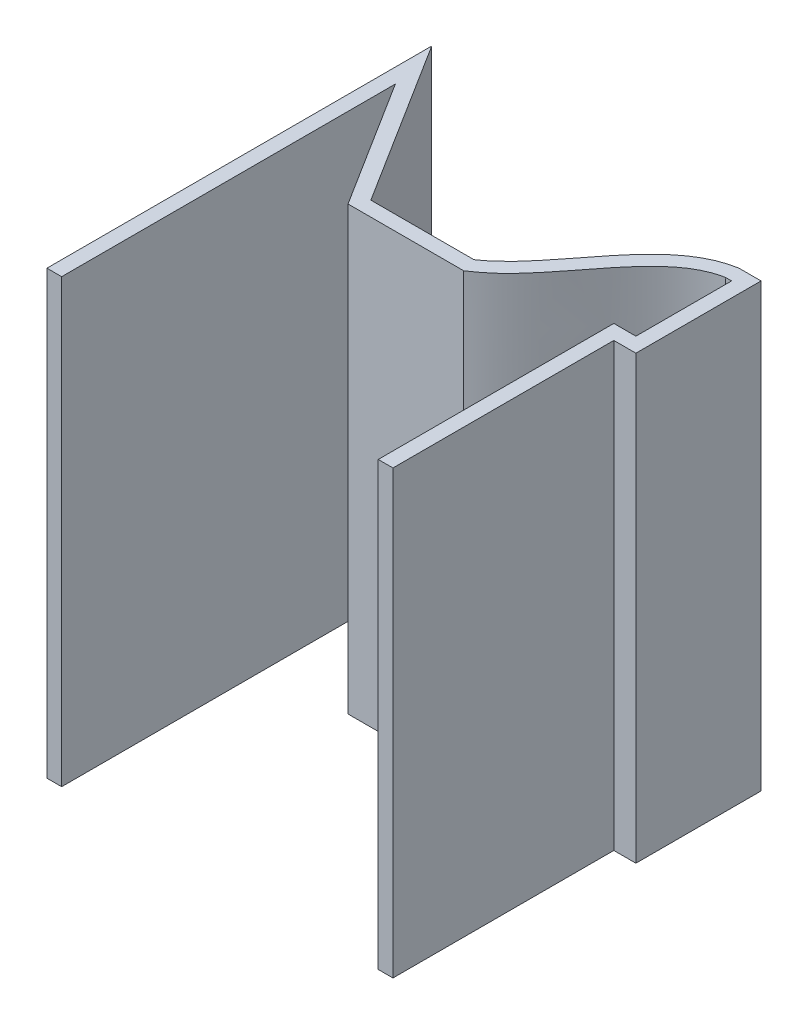
ISO-10303-21;
HEADER;
FILE_DESCRIPTION(('STEP AP214'),'2;1');
FILE_NAME('part.step','',(''),(''),'','','');
FILE_SCHEMA(('AUTOMOTIVE_DESIGN { 1 0 10303 214 1 1 1 1 }'));
ENDSEC;
DATA;
#1=APPLICATION_CONTEXT('core data for automotive mechanical design processes');
#2=APPLICATION_PROTOCOL_DEFINITION('international standard','automotive_design',2000,#1);
#3=PRODUCT_CONTEXT('',#1,'mechanical');
#4=PRODUCT('Part','Part','',(#3));
#5=PRODUCT_RELATED_PRODUCT_CATEGORY('part','',(#4));
#6=PRODUCT_DEFINITION_FORMATION('','',#4);
#7=PRODUCT_DEFINITION_CONTEXT('part definition',#1,'design');
#8=PRODUCT_DEFINITION('design','',#6,#7);
#9=PRODUCT_DEFINITION_SHAPE('','',#8);
#10=(LENGTH_UNIT() NAMED_UNIT(*) SI_UNIT(.MILLI.,.METRE.));
#11=(NAMED_UNIT(*) PLANE_ANGLE_UNIT() SI_UNIT($,.RADIAN.));
#12=(NAMED_UNIT(*) SI_UNIT($,.STERADIAN.) SOLID_ANGLE_UNIT());
#13=UNCERTAINTY_MEASURE_WITH_UNIT(LENGTH_MEASURE(1.E-05),#10,'distance_accuracy_value','');
#14=(GEOMETRIC_REPRESENTATION_CONTEXT(3) GLOBAL_UNCERTAINTY_ASSIGNED_CONTEXT((#13)) GLOBAL_UNIT_ASSIGNED_CONTEXT((#10,
#11,#12)) REPRESENTATION_CONTEXT('',''));
#15=CARTESIAN_POINT('',(0.,0.,0.));
#16=DIRECTION('',(0.,0.,1.));
#17=DIRECTION('',(1.,0.,0.));
#18=AXIS2_PLACEMENT_3D('',#15,#16,#17);
#19=CARTESIAN_POINT('',(-33.,60.,-30.));
#20=DIRECTION('',(0.,0.,1.));
#21=DIRECTION('',(1.,0.,0.));
#22=AXIS2_PLACEMENT_3D('',#19,#20,#21);
#23=PLANE('',#22);
#24=CARTESIAN_POINT('',(-26.,60.,-30.));
#25=DIRECTION('',(0.,0.,1.));
#26=DIRECTION('',(-1.,0.,0.));
#27=AXIS2_PLACEMENT_3D('',#24,#25,#26);
#28=CIRCLE('',#27,58.);
#29=CARTESIAN_POINT('',(-33.,2.42396331806087,-30.));
#30=VERTEX_POINT('',#29);
#31=CARTESIAN_POINT('',(-19.,2.42396331806087,-30.));
#32=VERTEX_POINT('',#31);
#33=EDGE_CURVE('E59',#30,#32,#28,.T.);
#34=ORIENTED_EDGE('',*,*,#33,.F.);
#35=DIRECTION('',(0.,-1.,0.));
#36=VECTOR('',#35,1.);
#37=CARTESIAN_POINT('',(-33.,60.,-30.));
#38=LINE('',#37,#36);
#39=CARTESIAN_POINT('',(-33.,60.,-30.));
#40=VERTEX_POINT('',#39);
#41=EDGE_CURVE('E449',#40,#30,#38,.T.);
#42=ORIENTED_EDGE('',*,*,#41,.F.);
#43=DIRECTION('',(-1.,0.,0.));
#44=VECTOR('',#43,1.);
#45=CARTESIAN_POINT('',(-33.,60.,-30.));
#46=LINE('',#45,#44);
#47=CARTESIAN_POINT('',(-19.,60.,-30.));
#48=VERTEX_POINT('',#47);
#49=EDGE_CURVE('E232',#48,#40,#46,.T.);
#50=ORIENTED_EDGE('',*,*,#49,.F.);
#51=DIRECTION('',(0.,-1.,0.));
#52=VECTOR('',#51,1.);
#53=CARTESIAN_POINT('',(-19.,60.,-30.));
#54=LINE('',#53,#52);
#55=EDGE_CURVE('E451',#48,#32,#54,.T.);
#56=ORIENTED_EDGE('',*,*,#55,.T.);
#57=EDGE_LOOP('',(#34,#42,#50,#56));
#58=FACE_BOUND('',#57,.T.);
#59=ADVANCED_FACE('F35',(#58),#23,.F.);
#60=CARTESIAN_POINT('',(-2.,60.,0.));
#61=DIRECTION('',(0.,0.,-1.));
#62=DIRECTION('',(-1.,0.,0.));
#63=AXIS2_PLACEMENT_3D('',#60,#61,#62);
#64=PLANE('',#63);
#65=DIRECTION('',(1.,0.,0.));
#66=VECTOR('',#65,1.);
#67=CARTESIAN_POINT('',(-2.,0.,0.));
#68=LINE('',#67,#66);
#69=CARTESIAN_POINT('',(-2.,0.,0.));
#70=VERTEX_POINT('',#69);
#71=CARTESIAN_POINT('',(0.,0.,0.));
#72=VERTEX_POINT('',#71);
#73=EDGE_CURVE('E206',#70,#72,#68,.T.);
#74=ORIENTED_EDGE('',*,*,#73,.T.);
#75=DIRECTION('',(0.,-1.,0.));
#76=VECTOR('',#75,1.);
#77=CARTESIAN_POINT('',(0.,60.,0.));
#78=LINE('',#77,#76);
#79=CARTESIAN_POINT('',(0.,60.,0.));
#80=VERTEX_POINT('',#79);
#81=EDGE_CURVE('E11',#80,#72,#78,.T.);
#82=ORIENTED_EDGE('',*,*,#81,.F.);
#83=DIRECTION('',(1.,0.,0.));
#84=VECTOR('',#83,1.);
#85=CARTESIAN_POINT('',(-2.,60.,0.));
#86=LINE('',#85,#84);
#87=CARTESIAN_POINT('',(-2.,60.,0.));
#88=VERTEX_POINT('',#87);
#89=EDGE_CURVE('E215',#88,#80,#86,.T.);
#90=ORIENTED_EDGE('',*,*,#89,.F.);
#91=DIRECTION('',(0.,-1.,0.));
#92=VECTOR('',#91,1.);
#93=CARTESIAN_POINT('',(-2.,60.,0.));
#94=LINE('',#93,#92);
#95=EDGE_CURVE('E375',#88,#70,#94,.T.);
#96=ORIENTED_EDGE('',*,*,#95,.T.);
#97=EDGE_LOOP('',(#74,#82,#90,#96));
#98=FACE_BOUND('',#97,.T.);
#99=ADVANCED_FACE('F37',(#98),#64,.F.);
#100=CARTESIAN_POINT('',(0.,60.,0.));
#101=DIRECTION('',(-1.,0.,0.));
#102=DIRECTION('',(0.,0.,1.));
#103=AXIS2_PLACEMENT_3D('',#100,#101,#102);
#104=PLANE('',#103);
#105=DIRECTION('',(0.,0.,-1.));
#106=VECTOR('',#105,1.);
#107=CARTESIAN_POINT('',(0.,0.,0.));
#108=LINE('',#107,#106);
#109=CARTESIAN_POINT('',(0.,0.,-30.));
#110=VERTEX_POINT('',#109);
#111=EDGE_CURVE('E209',#72,#110,#108,.T.);
#112=ORIENTED_EDGE('',*,*,#111,.T.);
#113=DIRECTION('',(0.,-1.,0.));
#114=VECTOR('',#113,1.);
#115=CARTESIAN_POINT('',(0.,60.,-30.));
#116=LINE('',#115,#114);
#117=CARTESIAN_POINT('',(0.,60.,-30.));
#118=VERTEX_POINT('',#117);
#119=EDGE_CURVE('E44',#118,#110,#116,.T.);
#120=ORIENTED_EDGE('',*,*,#119,.F.);
#121=DIRECTION('',(0.,0.,-1.));
#122=VECTOR('',#121,1.);
#123=CARTESIAN_POINT('',(0.,60.,0.));
#124=LINE('',#123,#122);
#125=EDGE_CURVE('E218',#80,#118,#124,.T.);
#126=ORIENTED_EDGE('',*,*,#125,.F.);
#127=ORIENTED_EDGE('',*,*,#81,.T.);
#128=EDGE_LOOP('',(#112,#120,#126,#127));
#129=FACE_BOUND('',#128,.T.);
#130=ADVANCED_FACE('F254',(#129),#104,.F.);
#131=CARTESIAN_POINT('',(3.00000000000001,60.,-30.));
#132=DIRECTION('',(0.,0.,-1.));
#133=DIRECTION('',(-1.,0.,0.));
#134=AXIS2_PLACEMENT_3D('',#131,#132,#133);
#135=PLANE('',#134);
#136=DIRECTION('',(1.,0.,0.));
#137=VECTOR('',#136,1.);
#138=CARTESIAN_POINT('',(3.00000000000001,0.,-30.));
#139=LINE('',#138,#137);
#140=CARTESIAN_POINT('',(3.00000000000001,0.,-30.));
#141=VERTEX_POINT('',#140);
#142=EDGE_CURVE('E378',#110,#141,#139,.T.);
#143=ORIENTED_EDGE('',*,*,#142,.T.);
#144=DIRECTION('',(0.,-1.,0.));
#145=VECTOR('',#144,1.);
#146=CARTESIAN_POINT('',(3.00000000000001,60.,-30.));
#147=LINE('',#146,#145);
#148=CARTESIAN_POINT('',(3.00000000000001,60.,-30.));
#149=VERTEX_POINT('',#148);
#150=EDGE_CURVE('E512',#149,#141,#147,.T.);
#151=ORIENTED_EDGE('',*,*,#150,.F.);
#152=DIRECTION('',(1.,0.,0.));
#153=VECTOR('',#152,1.);
#154=CARTESIAN_POINT('',(3.00000000000001,60.,-30.));
#155=LINE('',#154,#153);
#156=EDGE_CURVE('E221',#118,#149,#155,.T.);
#157=ORIENTED_EDGE('',*,*,#156,.F.);
#158=ORIENTED_EDGE('',*,*,#119,.T.);
#159=EDGE_LOOP('',(#143,#151,#157,#158));
#160=FACE_BOUND('',#159,.T.);
#161=ADVANCED_FACE('F251',(#160),#135,.F.);
#162=CARTESIAN_POINT('',(3.00000000000001,60.,-47.));
#163=DIRECTION('',(-1.,0.,0.));
#164=DIRECTION('',(0.,0.,1.));
#165=AXIS2_PLACEMENT_3D('',#162,#163,#164);
#166=PLANE('',#165);
#167=DIRECTION('',(0.,0.,-1.));
#168=VECTOR('',#167,1.);
#169=CARTESIAN_POINT('',(3.00000000000001,0.,-47.));
#170=LINE('',#169,#168);
#171=CARTESIAN_POINT('',(3.00000000000001,0.,-47.));
#172=VERTEX_POINT('',#171);
#173=EDGE_CURVE('E380',#141,#172,#170,.T.);
#174=ORIENTED_EDGE('',*,*,#173,.T.);
#175=DIRECTION('',(0.,-1.,0.));
#176=VECTOR('',#175,1.);
#177=CARTESIAN_POINT('',(3.00000000000001,60.,-47.));
#178=LINE('',#177,#176);
#179=CARTESIAN_POINT('',(3.00000000000001,60.,-47.));
#180=VERTEX_POINT('',#179);
#181=EDGE_CURVE('E520',#180,#172,#178,.T.);
#182=ORIENTED_EDGE('',*,*,#181,.F.);
#183=DIRECTION('',(0.,0.,-1.));
#184=VECTOR('',#183,1.);
#185=CARTESIAN_POINT('',(3.00000000000001,60.,-47.));
#186=LINE('',#185,#184);
#187=EDGE_CURVE('E223',#149,#180,#186,.T.);
#188=ORIENTED_EDGE('',*,*,#187,.F.);
#189=ORIENTED_EDGE('',*,*,#150,.T.);
#190=EDGE_LOOP('',(#174,#182,#188,#189));
#191=FACE_BOUND('',#190,.T.);
#192=ADVANCED_FACE('F247',(#191),#166,.F.);
#193=CARTESIAN_POINT('',(0.,60.,-47.));
#194=DIRECTION('',(0.,0.,1.));
#195=DIRECTION('',(1.,0.,0.));
#196=AXIS2_PLACEMENT_3D('',#193,#194,#195);
#197=PLANE('',#196);
#198=DIRECTION('',(-1.,0.,0.));
#199=VECTOR('',#198,1.);
#200=CARTESIAN_POINT('',(0.,0.,-47.));
#201=LINE('',#200,#199);
#202=CARTESIAN_POINT('',(0.,0.,-47.));
#203=VERTEX_POINT('',#202);
#204=EDGE_CURVE('E382',#172,#203,#201,.T.);
#205=ORIENTED_EDGE('',*,*,#204,.T.);
#206=DIRECTION('',(0.,-1.,0.));
#207=VECTOR('',#206,1.);
#208=CARTESIAN_POINT('',(0.,60.,-47.));
#209=LINE('',#208,#207);
#210=CARTESIAN_POINT('',(0.,60.,-47.));
#211=VERTEX_POINT('',#210);
#212=EDGE_CURVE('E454',#211,#203,#209,.T.);
#213=ORIENTED_EDGE('',*,*,#212,.F.);
#214=DIRECTION('',(-1.,0.,0.));
#215=VECTOR('',#214,1.);
#216=CARTESIAN_POINT('',(0.,60.,-47.));
#217=LINE('',#216,#215);
#218=EDGE_CURVE('E225',#180,#211,#217,.T.);
#219=ORIENTED_EDGE('',*,*,#218,.F.);
#220=ORIENTED_EDGE('',*,*,#181,.T.);
#221=EDGE_LOOP('',(#205,#213,#219,#220));
#222=FACE_BOUND('',#221,.T.);
#223=ADVANCED_FACE('F243',(#222),#197,.F.);
#224=CARTESIAN_POINT('',(0.,60.,-47.));
#225=CARTESIAN_POINT('',(-8.73584233414626,60.,-45.5222627040715));
#226=CARTESIAN_POINT('',(-12.4111987064461,60.,-34.4626890083698));
#227=CARTESIAN_POINT('',(-19.,60.,-30.));
#228=B_SPLINE_CURVE_WITH_KNOTS('',3,(#224,#225,#226,#227),.UNSPECIFIED.,.F.,.F.,(4,4),(0.,1.),.UNSPECIFIED.);
#229=DIRECTION('',(0.,-1.,0.));
#230=VECTOR('',#229,1.);
#231=SURFACE_OF_LINEAR_EXTRUSION('',#228,#230);
#232=CARTESIAN_POINT('',(0.,0.,-47.));
#233=CARTESIAN_POINT('',(-8.73584233414626,0.,-45.5222627040715));
#234=CARTESIAN_POINT('',(-12.4111987064461,0.,-34.4626890083698));
#235=CARTESIAN_POINT('',(-19.,0.,-30.));
#236=B_SPLINE_CURVE_WITH_KNOTS('',3,(#232,#233,#234,#235),.UNSPECIFIED.,.F.,.F.,(4,4),(0.,1.),.UNSPECIFIED.);
#237=CARTESIAN_POINT('',(-19.,0.,-30.));
#238=VERTEX_POINT('',#237);
#239=EDGE_CURVE('E384',#203,#238,#236,.T.);
#240=ORIENTED_EDGE('',*,*,#239,.T.);
#241=DIRECTION('',(0.,-1.,0.));
#242=VECTOR('',#241,1.);
#243=CARTESIAN_POINT('',(-19.,0.,-30.));
#244=LINE('',#243,#242);
#245=EDGE_CURVE('E52',#32,#238,#244,.T.);
#246=ORIENTED_EDGE('',*,*,#245,.F.);
#247=ORIENTED_EDGE('',*,*,#55,.F.);
#248=EDGE_CURVE('E227',#211,#48,#228,.T.);
#249=ORIENTED_EDGE('',*,*,#248,.F.);
#250=ORIENTED_EDGE('',*,*,#212,.T.);
#251=EDGE_LOOP('',(#240,#246,#247,#249,#250));
#252=FACE_BOUND('',#251,.T.);
#253=ADVANCED_FACE('F238',(#252),#231,.F.);
#254=CARTESIAN_POINT('',(-47.0000000000014,60.,-52.2683878090264));
#255=DIRECTION('',(-0.846589823711185,0.,0.532245873998723));
#256=DIRECTION('',(0.532245873998723,0.,0.846589823711185));
#257=AXIS2_PLACEMENT_3D('',#254,#255,#256);
#258=PLANE('',#257);
#259=DIRECTION('',(-0.532245873998723,0.,-0.846589823711185));
#260=VECTOR('',#259,1.);
#261=CARTESIAN_POINT('',(-47.0000000000014,0.,-52.2683878090264));
#262=LINE('',#261,#260);
#263=CARTESIAN_POINT('',(-33.,0.,-30.));
#264=VERTEX_POINT('',#263);
#265=CARTESIAN_POINT('',(-47.0000000000014,0.,-52.2683878090264));
#266=VERTEX_POINT('',#265);
#267=EDGE_CURVE('E388',#264,#266,#262,.T.);
#268=ORIENTED_EDGE('',*,*,#267,.T.);
#269=DIRECTION('',(0.,-1.,0.));
#270=VECTOR('',#269,1.);
#271=CARTESIAN_POINT('',(-47.0000000000014,60.,-52.2683878090264));
#272=LINE('',#271,#270);
#273=CARTESIAN_POINT('',(-47.0000000000014,60.,-52.2683878090264));
#274=VERTEX_POINT('',#273);
#275=EDGE_CURVE('E446',#274,#266,#272,.T.);
#276=ORIENTED_EDGE('',*,*,#275,.F.);
#277=DIRECTION('',(-0.532245873998723,0.,-0.846589823711185));
#278=VECTOR('',#277,1.);
#279=CARTESIAN_POINT('',(-47.0000000000014,60.,-52.2683878090264));
#280=LINE('',#279,#278);
#281=EDGE_CURVE('E476',#40,#274,#280,.T.);
#282=ORIENTED_EDGE('',*,*,#281,.F.);
#283=ORIENTED_EDGE('',*,*,#41,.T.);
#284=DIRECTION('',(0.,1.,0.));
#285=VECTOR('',#284,1.);
#286=CARTESIAN_POINT('',(-33.,0.,-30.));
#287=LINE('',#286,#285);
#288=EDGE_CURVE('E205',#264,#30,#287,.T.);
#289=ORIENTED_EDGE('',*,*,#288,.F.);
#290=EDGE_LOOP('',(#268,#276,#282,#283,#289));
#291=FACE_BOUND('',#290,.T.);
#292=ADVANCED_FACE('F242',(#291),#258,.F.);
#293=CARTESIAN_POINT('',(-47.0000000000014,60.,0.));
#294=DIRECTION('',(1.,0.,0.));
#295=DIRECTION('',(0.,0.,-1.));
#296=AXIS2_PLACEMENT_3D('',#293,#294,#295);
#297=PLANE('',#296);
#298=DIRECTION('',(0.,0.,1.));
#299=VECTOR('',#298,1.);
#300=CARTESIAN_POINT('',(-47.0000000000014,0.,0.));
#301=LINE('',#300,#299);
#302=CARTESIAN_POINT('',(-47.0000000000014,0.,0.));
#303=VERTEX_POINT('',#302);
#304=EDGE_CURVE('E393',#266,#303,#301,.T.);
#305=ORIENTED_EDGE('',*,*,#304,.T.);
#306=DIRECTION('',(0.,-1.,0.));
#307=VECTOR('',#306,1.);
#308=CARTESIAN_POINT('',(-47.0000000000014,60.,0.));
#309=LINE('',#308,#307);
#310=CARTESIAN_POINT('',(-47.0000000000014,60.,0.));
#311=VERTEX_POINT('',#310);
#312=EDGE_CURVE('E443',#311,#303,#309,.T.);
#313=ORIENTED_EDGE('',*,*,#312,.F.);
#314=DIRECTION('',(0.,0.,1.));
#315=VECTOR('',#314,1.);
#316=CARTESIAN_POINT('',(-47.0000000000014,60.,0.));
#317=LINE('',#316,#315);
#318=EDGE_CURVE('E478',#274,#311,#317,.T.);
#319=ORIENTED_EDGE('',*,*,#318,.F.);
#320=ORIENTED_EDGE('',*,*,#275,.T.);
#321=EDGE_LOOP('',(#305,#313,#319,#320));
#322=FACE_BOUND('',#321,.T.);
#323=ADVANCED_FACE('F284',(#322),#297,.F.);
#324=CARTESIAN_POINT('',(-47.0000000000014,60.,0.));
#325=DIRECTION('',(0.,0.,-1.));
#326=DIRECTION('',(-1.,0.,0.));
#327=AXIS2_PLACEMENT_3D('',#324,#325,#326);
#328=PLANE('',#327);
#329=DIRECTION('',(1.,0.,0.));
#330=VECTOR('',#329,1.);
#331=CARTESIAN_POINT('',(-47.0000000000014,0.,0.));
#332=LINE('',#331,#330);
#333=CARTESIAN_POINT('',(-45.0000000000014,0.,0.));
#334=VERTEX_POINT('',#333);
#335=EDGE_CURVE('E395',#303,#334,#332,.T.);
#336=ORIENTED_EDGE('',*,*,#335,.T.);
#337=DIRECTION('',(0.,-1.,0.));
#338=VECTOR('',#337,1.);
#339=CARTESIAN_POINT('',(-45.0000000000014,60.,0.));
#340=LINE('',#339,#338);
#341=CARTESIAN_POINT('',(-45.0000000000014,60.,0.));
#342=VERTEX_POINT('',#341);
#343=EDGE_CURVE('E440',#342,#334,#340,.T.);
#344=ORIENTED_EDGE('',*,*,#343,.F.);
#345=DIRECTION('',(1.,0.,0.));
#346=VECTOR('',#345,1.);
#347=CARTESIAN_POINT('',(-47.0000000000014,60.,0.));
#348=LINE('',#347,#346);
#349=EDGE_CURVE('E479',#311,#342,#348,.T.);
#350=ORIENTED_EDGE('',*,*,#349,.F.);
#351=ORIENTED_EDGE('',*,*,#312,.T.);
#352=EDGE_LOOP('',(#336,#344,#350,#351));
#353=FACE_BOUND('',#352,.T.);
#354=ADVANCED_FACE('F537',(#353),#328,.F.);
#355=CARTESIAN_POINT('',(-45.0000000000014,60.,0.));
#356=DIRECTION('',(-1.,0.,0.));
#357=DIRECTION('',(0.,0.,1.));
#358=AXIS2_PLACEMENT_3D('',#355,#356,#357);
#359=PLANE('',#358);
#360=DIRECTION('',(0.,0.,-1.));
#361=VECTOR('',#360,1.);
#362=CARTESIAN_POINT('',(-45.0000000000014,0.,0.));
#363=LINE('',#362,#361);
#364=CARTESIAN_POINT('',(-45.0000000000014,0.,-45.3295277298006));
#365=VERTEX_POINT('',#364);
#366=EDGE_CURVE('E397',#334,#365,#363,.T.);
#367=ORIENTED_EDGE('',*,*,#366,.T.);
#368=DIRECTION('',(0.,-1.,0.));
#369=VECTOR('',#368,1.);
#370=CARTESIAN_POINT('',(-45.0000000000014,60.,-45.3295277298006));
#371=LINE('',#370,#369);
#372=CARTESIAN_POINT('',(-45.0000000000014,60.,-45.3295277298006));
#373=VERTEX_POINT('',#372);
#374=EDGE_CURVE('E437',#373,#365,#371,.T.);
#375=ORIENTED_EDGE('',*,*,#374,.F.);
#376=DIRECTION('',(0.,0.,-1.));
#377=VECTOR('',#376,1.);
#378=CARTESIAN_POINT('',(-45.0000000000014,60.,0.));
#379=LINE('',#378,#377);
#380=EDGE_CURVE('E483',#342,#373,#379,.T.);
#381=ORIENTED_EDGE('',*,*,#380,.F.);
#382=ORIENTED_EDGE('',*,*,#343,.T.);
#383=EDGE_LOOP('',(#367,#375,#381,#382));
#384=FACE_BOUND('',#383,.T.);
#385=ADVANCED_FACE('F533',(#384),#359,.F.);
#386=CARTESIAN_POINT('',(-45.0000000000014,60.,-45.3295277298006));
#387=DIRECTION('',(0.846589823711185,0.,-0.532245873998723));
#388=DIRECTION('',(-0.532245873998723,0.,-0.846589823711185));
#389=AXIS2_PLACEMENT_3D('',#386,#387,#388);
#390=PLANE('',#389);
#391=DIRECTION('',(0.532245873998723,0.,0.846589823711185));
#392=VECTOR('',#391,1.);
#393=CARTESIAN_POINT('',(-45.0000000000014,0.,-45.3295277298006));
#394=LINE('',#393,#392);
#395=CARTESIAN_POINT('',(-34.1050312982757,0.,-28.));
#396=VERTEX_POINT('',#395);
#397=EDGE_CURVE('E399',#365,#396,#394,.T.);
#398=ORIENTED_EDGE('',*,*,#397,.T.);
#399=DIRECTION('',(0.,-1.,0.));
#400=VECTOR('',#399,1.);
#401=CARTESIAN_POINT('',(-34.1050312982757,60.,-28.));
#402=LINE('',#401,#400);
#403=CARTESIAN_POINT('',(-34.1050312982757,60.,-28.));
#404=VERTEX_POINT('',#403);
#405=EDGE_CURVE('E434',#404,#396,#402,.T.);
#406=ORIENTED_EDGE('',*,*,#405,.F.);
#407=DIRECTION('',(0.532245873998723,0.,0.846589823711185));
#408=VECTOR('',#407,1.);
#409=CARTESIAN_POINT('',(-45.0000000000014,60.,-45.3295277298006));
#410=LINE('',#409,#408);
#411=EDGE_CURVE('E484',#373,#404,#410,.T.);
#412=ORIENTED_EDGE('',*,*,#411,.F.);
#413=ORIENTED_EDGE('',*,*,#374,.T.);
#414=EDGE_LOOP('',(#398,#406,#412,#413));
#415=FACE_BOUND('',#414,.T.);
#416=ADVANCED_FACE('F529',(#415),#390,.F.);
#417=CARTESIAN_POINT('',(-34.1050312982757,60.,-28.));
#418=DIRECTION('',(0.,0.,-1.));
#419=DIRECTION('',(-1.,0.,0.));
#420=AXIS2_PLACEMENT_3D('',#417,#418,#419);
#421=PLANE('',#420);
#422=DIRECTION('',(1.,0.,0.));
#423=VECTOR('',#422,1.);
#424=CARTESIAN_POINT('',(-34.1050312982757,0.,-28.));
#425=LINE('',#424,#423);
#426=CARTESIAN_POINT('',(-18.3864321192035,0.,-28.));
#427=VERTEX_POINT('',#426);
#428=EDGE_CURVE('E401',#396,#427,#425,.T.);
#429=ORIENTED_EDGE('',*,*,#428,.T.);
#430=DIRECTION('',(0.,-1.,0.));
#431=VECTOR('',#430,1.);
#432=CARTESIAN_POINT('',(-18.3864321192035,60.,-28.));
#433=LINE('',#432,#431);
#434=CARTESIAN_POINT('',(-18.3864321192035,60.,-28.));
#435=VERTEX_POINT('',#434);
#436=EDGE_CURVE('E431',#435,#427,#433,.T.);
#437=ORIENTED_EDGE('',*,*,#436,.F.);
#438=DIRECTION('',(1.,0.,0.));
#439=VECTOR('',#438,1.);
#440=CARTESIAN_POINT('',(-34.1050312982757,60.,-28.));
#441=LINE('',#440,#439);
#442=EDGE_CURVE('E364',#404,#435,#441,.T.);
#443=ORIENTED_EDGE('',*,*,#442,.F.);
#444=ORIENTED_EDGE('',*,*,#405,.T.);
#445=EDGE_LOOP('',(#429,#437,#443,#444));
#446=FACE_BOUND('',#445,.T.);
#447=ADVANCED_FACE('F354',(#446),#421,.F.);
#448=CARTESIAN_POINT('',(-18.3864321192035,60.,-28.));
#449=CARTESIAN_POINT('',(-18.2815893742478,60.,-28.0710114851967));
#450=CARTESIAN_POINT('',(-18.0760068723759,60.,-28.2106437719707));
#451=CARTESIAN_POINT('',(-17.6320179643157,60.,-28.509033814474));
#452=CARTESIAN_POINT('',(-16.7887521593678,60.,-29.1277652283063));
#453=CARTESIAN_POINT('',(-15.2661015968213,60.,-30.4367065139176));
#454=CARTESIAN_POINT('',(-13.2817697640349,60.,-32.5788076211878));
#455=CARTESIAN_POINT('',(-11.1163234460396,60.,-35.322397152847));
#456=CARTESIAN_POINT('',(-8.32798345233119,60.,-38.971629636865));
#457=CARTESIAN_POINT('',(-4.79633227596985,60.,-42.9892919880486));
#458=CARTESIAN_POINT('',(-1.60539687193576,60.,-44.6674290510028));
#459=CARTESIAN_POINT('',(0.176102142023165,60.,-45.));
#460=B_SPLINE_CURVE_WITH_KNOTS('',3,(#448,#449,#450,#451,#452,#453,#454,#455,#456,#457,#458,
#459),.UNSPECIFIED.,.F.,.F.,(4,1,1,1,1,1,1,1,1,4),(0.00731574432767523,0.0232280082258565,
0.0391402721240377,0.0709647999204002,0.134613855513125,0.261911966698575,0.389210077884025,
0.516508189069474,0.771104411440374,1.02570063381127),.UNSPECIFIED.);
#461=DIRECTION('',(0.,-1.,0.));
#462=VECTOR('',#461,1.);
#463=SURFACE_OF_LINEAR_EXTRUSION('',#460,#462);
#464=CARTESIAN_POINT('',(-18.3864321192035,0.,-28.));
#465=CARTESIAN_POINT('',(-18.2815893742478,0.,-28.0710114851967));
#466=CARTESIAN_POINT('',(-18.0760068723759,0.,-28.2106437719707));
#467=CARTESIAN_POINT('',(-17.6320179643157,0.,-28.509033814474));
#468=CARTESIAN_POINT('',(-16.7887521593678,0.,-29.1277652283063));
#469=CARTESIAN_POINT('',(-15.2661015968213,0.,-30.4367065139176));
#470=CARTESIAN_POINT('',(-13.2817697640349,0.,-32.5788076211878));
#471=CARTESIAN_POINT('',(-11.1163234460396,0.,-35.322397152847));
#472=CARTESIAN_POINT('',(-8.32798345233119,0.,-38.971629636865));
#473=CARTESIAN_POINT('',(-4.79633227596985,0.,-42.9892919880486));
#474=CARTESIAN_POINT('',(-1.60539687193576,0.,-44.6674290510028));
#475=CARTESIAN_POINT('',(0.176102142023165,0.,-45.));
#476=B_SPLINE_CURVE_WITH_KNOTS('',3,(#464,#465,#466,#467,#468,#469,#470,#471,#472,#473,#474,
#475),.UNSPECIFIED.,.F.,.F.,(4,1,1,1,1,1,1,1,1,4),(0.00731574432767523,0.0232280082258565,
0.0391402721240377,0.0709647999204002,0.134613855513125,0.261911966698575,0.389210077884025,
0.516508189069474,0.771104411440374,1.02570063381127),.UNSPECIFIED.);
#477=CARTESIAN_POINT('',(0.176102142023165,0.,-45.));
#478=VERTEX_POINT('',#477);
#479=EDGE_CURVE('E403',#427,#478,#476,.T.);
#480=ORIENTED_EDGE('',*,*,#479,.T.);
#481=DIRECTION('',(0.,-1.,0.));
#482=VECTOR('',#481,1.);
#483=CARTESIAN_POINT('',(0.176102142023165,60.,-45.));
#484=LINE('',#483,#482);
#485=CARTESIAN_POINT('',(0.176102142023165,60.,-45.));
#486=VERTEX_POINT('',#485);
#487=EDGE_CURVE('E428',#486,#478,#484,.T.);
#488=ORIENTED_EDGE('',*,*,#487,.F.);
#489=EDGE_CURVE('E357',#435,#486,#460,.T.);
#490=ORIENTED_EDGE('',*,*,#489,.F.);
#491=ORIENTED_EDGE('',*,*,#436,.T.);
#492=EDGE_LOOP('',(#480,#488,#490,#491));
#493=FACE_BOUND('',#492,.T.);
#494=ADVANCED_FACE('F349',(#493),#463,.F.);
#495=CARTESIAN_POINT('',(0.176102142023165,60.,-45.));
#496=DIRECTION('',(0.,0.,-1.));
#497=DIRECTION('',(-1.,0.,0.));
#498=AXIS2_PLACEMENT_3D('',#495,#496,#497);
#499=PLANE('',#498);
#500=DIRECTION('',(1.,0.,0.));
#501=VECTOR('',#500,1.);
#502=CARTESIAN_POINT('',(0.176102142023165,0.,-45.));
#503=LINE('',#502,#501);
#504=CARTESIAN_POINT('',(1.00000000000001,0.,-45.));
#505=VERTEX_POINT('',#504);
#506=EDGE_CURVE('E407',#478,#505,#503,.T.);
#507=ORIENTED_EDGE('',*,*,#506,.T.);
#508=DIRECTION('',(0.,-1.,0.));
#509=VECTOR('',#508,1.);
#510=CARTESIAN_POINT('',(1.00000000000001,60.,-45.));
#511=LINE('',#510,#509);
#512=CARTESIAN_POINT('',(1.00000000000001,60.,-45.));
#513=VERTEX_POINT('',#512);
#514=EDGE_CURVE('E425',#513,#505,#511,.T.);
#515=ORIENTED_EDGE('',*,*,#514,.F.);
#516=DIRECTION('',(1.,0.,0.));
#517=VECTOR('',#516,1.);
#518=CARTESIAN_POINT('',(0.176102142023165,60.,-45.));
#519=LINE('',#518,#517);
#520=EDGE_CURVE('E363',#486,#513,#519,.T.);
#521=ORIENTED_EDGE('',*,*,#520,.F.);
#522=ORIENTED_EDGE('',*,*,#487,.T.);
#523=EDGE_LOOP('',(#507,#515,#521,#522));
#524=FACE_BOUND('',#523,.T.);
#525=ADVANCED_FACE('F345',(#524),#499,.F.);
#526=CARTESIAN_POINT('',(1.00000000000001,60.,-45.));
#527=DIRECTION('',(1.,0.,0.));
#528=DIRECTION('',(0.,0.,-1.));
#529=AXIS2_PLACEMENT_3D('',#526,#527,#528);
#530=PLANE('',#529);
#531=DIRECTION('',(0.,0.,1.));
#532=VECTOR('',#531,1.);
#533=CARTESIAN_POINT('',(1.00000000000001,0.,-45.));
#534=LINE('',#533,#532);
#535=CARTESIAN_POINT('',(1.00000000000001,0.,-32.));
#536=VERTEX_POINT('',#535);
#537=EDGE_CURVE('E412',#505,#536,#534,.T.);
#538=ORIENTED_EDGE('',*,*,#537,.T.);
#539=DIRECTION('',(0.,-1.,0.));
#540=VECTOR('',#539,1.);
#541=CARTESIAN_POINT('',(1.00000000000001,60.,-32.));
#542=LINE('',#541,#540);
#543=CARTESIAN_POINT('',(1.00000000000001,60.,-32.));
#544=VERTEX_POINT('',#543);
#545=EDGE_CURVE('E422',#544,#536,#542,.T.);
#546=ORIENTED_EDGE('',*,*,#545,.F.);
#547=DIRECTION('',(0.,0.,1.));
#548=VECTOR('',#547,1.);
#549=CARTESIAN_POINT('',(1.00000000000001,60.,-45.));
#550=LINE('',#549,#548);
#551=EDGE_CURVE('E370',#513,#544,#550,.T.);
#552=ORIENTED_EDGE('',*,*,#551,.F.);
#553=ORIENTED_EDGE('',*,*,#514,.T.);
#554=EDGE_LOOP('',(#538,#546,#552,#553));
#555=FACE_BOUND('',#554,.T.);
#556=ADVANCED_FACE('F341',(#555),#530,.F.);
#557=CARTESIAN_POINT('',(1.00000000000001,60.,-32.));
#558=DIRECTION('',(0.,0.,1.));
#559=DIRECTION('',(1.,0.,0.));
#560=AXIS2_PLACEMENT_3D('',#557,#558,#559);
#561=PLANE('',#560);
#562=DIRECTION('',(-1.,0.,0.));
#563=VECTOR('',#562,1.);
#564=CARTESIAN_POINT('',(1.00000000000001,0.,-32.));
#565=LINE('',#564,#563);
#566=CARTESIAN_POINT('',(-2.,0.,-32.));
#567=VERTEX_POINT('',#566);
#568=EDGE_CURVE('E414',#536,#567,#565,.T.);
#569=ORIENTED_EDGE('',*,*,#568,.T.);
#570=DIRECTION('',(0.,-1.,0.));
#571=VECTOR('',#570,1.);
#572=CARTESIAN_POINT('',(-2.,60.,-32.));
#573=LINE('',#572,#571);
#574=CARTESIAN_POINT('',(-2.,60.,-32.));
#575=VERTEX_POINT('',#574);
#576=EDGE_CURVE('E419',#575,#567,#573,.T.);
#577=ORIENTED_EDGE('',*,*,#576,.F.);
#578=DIRECTION('',(-1.,0.,0.));
#579=VECTOR('',#578,1.);
#580=CARTESIAN_POINT('',(1.00000000000001,60.,-32.));
#581=LINE('',#580,#579);
#582=EDGE_CURVE('E372',#544,#575,#581,.T.);
#583=ORIENTED_EDGE('',*,*,#582,.F.);
#584=ORIENTED_EDGE('',*,*,#545,.T.);
#585=EDGE_LOOP('',(#569,#577,#583,#584));
#586=FACE_BOUND('',#585,.T.);
#587=ADVANCED_FACE('F337',(#586),#561,.F.);
#588=CARTESIAN_POINT('',(-2.,60.,0.));
#589=DIRECTION('',(1.,0.,0.));
#590=DIRECTION('',(0.,0.,-1.));
#591=AXIS2_PLACEMENT_3D('',#588,#589,#590);
#592=PLANE('',#591);
#593=DIRECTION('',(0.,0.,1.));
#594=VECTOR('',#593,1.);
#595=CARTESIAN_POINT('',(-2.,0.,0.));
#596=LINE('',#595,#594);
#597=EDGE_CURVE('E219',#567,#70,#596,.T.);
#598=ORIENTED_EDGE('',*,*,#597,.T.);
#599=ORIENTED_EDGE('',*,*,#95,.F.);
#600=DIRECTION('',(0.,0.,1.));
#601=VECTOR('',#600,1.);
#602=CARTESIAN_POINT('',(-2.,60.,0.));
#603=LINE('',#602,#601);
#604=EDGE_CURVE('E374',#575,#88,#603,.T.);
#605=ORIENTED_EDGE('',*,*,#604,.F.);
#606=ORIENTED_EDGE('',*,*,#576,.T.);
#607=EDGE_LOOP('',(#598,#599,#605,#606));
#608=FACE_BOUND('',#607,.T.);
#609=ADVANCED_FACE('F332',(#608),#592,.F.);
#610=CARTESIAN_POINT('',(-10.3051403902222,60.,-39.6193568921655));
#611=DIRECTION('',(0.,-1.,0.));
#612=DIRECTION('',(0.,0.,-1.));
#613=AXIS2_PLACEMENT_3D('',#610,#611,#612);
#614=PLANE('',#613);
#615=ORIENTED_EDGE('',*,*,#89,.T.);
#616=ORIENTED_EDGE('',*,*,#125,.T.);
#617=ORIENTED_EDGE('',*,*,#156,.T.);
#618=ORIENTED_EDGE('',*,*,#187,.T.);
#619=ORIENTED_EDGE('',*,*,#218,.T.);
#620=ORIENTED_EDGE('',*,*,#248,.T.);
#621=ORIENTED_EDGE('',*,*,#49,.T.);
#622=ORIENTED_EDGE('',*,*,#281,.T.);
#623=ORIENTED_EDGE('',*,*,#318,.T.);
#624=ORIENTED_EDGE('',*,*,#349,.T.);
#625=ORIENTED_EDGE('',*,*,#380,.T.);
#626=ORIENTED_EDGE('',*,*,#411,.T.);
#627=ORIENTED_EDGE('',*,*,#442,.T.);
#628=ORIENTED_EDGE('',*,*,#489,.T.);
#629=ORIENTED_EDGE('',*,*,#520,.T.);
#630=ORIENTED_EDGE('',*,*,#551,.T.);
#631=ORIENTED_EDGE('',*,*,#582,.T.);
#632=ORIENTED_EDGE('',*,*,#604,.T.);
#633=EDGE_LOOP('',(#615,#616,#617,#618,#619,#620,#621,#622,#623,#624,#625,#626,#627,#628,#629,
#630,#631,#632));
#634=FACE_BOUND('',#633,.T.);
#635=ADVANCED_FACE('F271',(#634),#614,.F.);
#636=CARTESIAN_POINT('',(-10.3051403902222,0.,-39.6193568921655));
#637=DIRECTION('',(0.,-1.,0.));
#638=DIRECTION('',(0.,0.,-1.));
#639=AXIS2_PLACEMENT_3D('',#636,#637,#638);
#640=PLANE('',#639);
#641=ORIENTED_EDGE('',*,*,#73,.F.);
#642=ORIENTED_EDGE('',*,*,#597,.F.);
#643=ORIENTED_EDGE('',*,*,#568,.F.);
#644=ORIENTED_EDGE('',*,*,#537,.F.);
#645=ORIENTED_EDGE('',*,*,#506,.F.);
#646=ORIENTED_EDGE('',*,*,#479,.F.);
#647=ORIENTED_EDGE('',*,*,#428,.F.);
#648=ORIENTED_EDGE('',*,*,#397,.F.);
#649=ORIENTED_EDGE('',*,*,#366,.F.);
#650=ORIENTED_EDGE('',*,*,#335,.F.);
#651=ORIENTED_EDGE('',*,*,#304,.F.);
#652=ORIENTED_EDGE('',*,*,#267,.F.);
#653=DIRECTION('',(0.,0.,1.));
#654=VECTOR('',#653,1.);
#655=CARTESIAN_POINT('',(-33.,0.,-38.));
#656=LINE('',#655,#654);
#657=CARTESIAN_POINT('',(-33.,0.,-38.));
#658=VERTEX_POINT('',#657);
#659=EDGE_CURVE('E467',#658,#264,#656,.T.);
#660=ORIENTED_EDGE('',*,*,#659,.F.);
#661=DIRECTION('',(-1.,0.,0.));
#662=VECTOR('',#661,1.);
#663=CARTESIAN_POINT('',(-33.,0.,-38.));
#664=LINE('',#663,#662);
#665=CARTESIAN_POINT('',(-19.,0.,-38.));
#666=VERTEX_POINT('',#665);
#667=EDGE_CURVE('E198',#666,#658,#664,.T.);
#668=ORIENTED_EDGE('',*,*,#667,.F.);
#669=DIRECTION('',(0.,0.,1.));
#670=VECTOR('',#669,1.);
#671=CARTESIAN_POINT('',(-19.,0.,-38.));
#672=LINE('',#671,#670);
#673=EDGE_CURVE('E211',#666,#238,#672,.T.);
#674=ORIENTED_EDGE('',*,*,#673,.T.);
#675=ORIENTED_EDGE('',*,*,#239,.F.);
#676=ORIENTED_EDGE('',*,*,#204,.F.);
#677=ORIENTED_EDGE('',*,*,#173,.F.);
#678=ORIENTED_EDGE('',*,*,#142,.F.);
#679=ORIENTED_EDGE('',*,*,#111,.F.);
#680=EDGE_LOOP('',(#641,#642,#643,#644,#645,#646,#647,#648,#649,#650,#651,#652,#660,#668,#674,
#675,#676,#677,#678,#679));
#681=FACE_BOUND('',#680,.T.);
#682=ADVANCED_FACE('F289',(#681),#640,.T.);
#683=CARTESIAN_POINT('',(-33.,0.,-38.));
#684=DIRECTION('',(1.,0.,0.));
#685=DIRECTION('',(0.,0.,-1.));
#686=AXIS2_PLACEMENT_3D('',#683,#684,#685);
#687=PLANE('',#686);
#688=ORIENTED_EDGE('',*,*,#288,.T.);
#689=DIRECTION('',(0.,0.,1.));
#690=VECTOR('',#689,1.);
#691=CARTESIAN_POINT('',(-33.,2.42396331806087,-38.));
#692=LINE('',#691,#690);
#693=CARTESIAN_POINT('',(-33.,2.42396331806087,-38.));
#694=VERTEX_POINT('',#693);
#695=EDGE_CURVE('E186',#694,#30,#692,.T.);
#696=ORIENTED_EDGE('',*,*,#695,.F.);
#697=DIRECTION('',(0.,1.,0.));
#698=VECTOR('',#697,1.);
#699=CARTESIAN_POINT('',(-33.,0.,-38.));
#700=LINE('',#699,#698);
#701=EDGE_CURVE('E193',#658,#694,#700,.T.);
#702=ORIENTED_EDGE('',*,*,#701,.F.);
#703=ORIENTED_EDGE('',*,*,#659,.T.);
#704=EDGE_LOOP('',(#688,#696,#702,#703));
#705=FACE_BOUND('',#704,.T.);
#706=ADVANCED_FACE('F203',(#705),#687,.F.);
#707=CARTESIAN_POINT('',(-26.,60.,-38.));
#708=DIRECTION('',(0.,0.,1.));
#709=DIRECTION('',(1.,0.,0.));
#710=AXIS2_PLACEMENT_3D('',#707,#708,#709);
#711=CYLINDRICAL_SURFACE('',#710,58.);
#712=ORIENTED_EDGE('',*,*,#33,.T.);
#713=DIRECTION('',(0.,0.,1.));
#714=VECTOR('',#713,1.);
#715=CARTESIAN_POINT('',(-19.,2.42396331806087,-38.));
#716=LINE('',#715,#714);
#717=CARTESIAN_POINT('',(-19.,2.42396331806087,-38.));
#718=VERTEX_POINT('',#717);
#719=EDGE_CURVE('E189',#718,#32,#716,.T.);
#720=ORIENTED_EDGE('',*,*,#719,.F.);
#721=CARTESIAN_POINT('',(-26.,60.,-38.));
#722=DIRECTION('',(0.,0.,1.));
#723=DIRECTION('',(-1.,0.,0.));
#724=AXIS2_PLACEMENT_3D('',#721,#722,#723);
#725=CIRCLE('',#724,58.);
#726=EDGE_CURVE('E182',#694,#718,#725,.T.);
#727=ORIENTED_EDGE('',*,*,#726,.F.);
#728=ORIENTED_EDGE('',*,*,#695,.T.);
#729=EDGE_LOOP('',(#712,#720,#727,#728));
#730=FACE_BOUND('',#729,.T.);
#731=ADVANCED_FACE('F184',(#730),#711,.F.);
#732=CARTESIAN_POINT('',(-19.,0.,-38.));
#733=DIRECTION('',(-1.,0.,0.));
#734=DIRECTION('',(0.,0.,1.));
#735=AXIS2_PLACEMENT_3D('',#732,#733,#734);
#736=PLANE('',#735);
#737=ORIENTED_EDGE('',*,*,#245,.T.);
#738=ORIENTED_EDGE('',*,*,#673,.F.);
#739=DIRECTION('',(0.,-1.,0.));
#740=VECTOR('',#739,1.);
#741=CARTESIAN_POINT('',(-19.,0.,-38.));
#742=LINE('',#741,#740);
#743=EDGE_CURVE('E192',#718,#666,#742,.T.);
#744=ORIENTED_EDGE('',*,*,#743,.F.);
#745=ORIENTED_EDGE('',*,*,#719,.T.);
#746=EDGE_LOOP('',(#737,#738,#744,#745));
#747=FACE_BOUND('',#746,.T.);
#748=ADVANCED_FACE('F310',(#747),#736,.F.);
#749=CARTESIAN_POINT('',(-26.,60.,-38.));
#750=DIRECTION('',(0.,0.,-1.));
#751=DIRECTION('',(-1.,0.,0.));
#752=AXIS2_PLACEMENT_3D('',#749,#750,#751);
#753=PLANE('',#752);
#754=ORIENTED_EDGE('',*,*,#701,.T.);
#755=ORIENTED_EDGE('',*,*,#726,.T.);
#756=ORIENTED_EDGE('',*,*,#743,.T.);
#757=ORIENTED_EDGE('',*,*,#667,.T.);
#758=EDGE_LOOP('',(#754,#755,#756,#757));
#759=FACE_BOUND('',#758,.T.);
#760=ADVANCED_FACE('F196',(#759),#753,.T.);
#761=CLOSED_SHELL('',(#59,#99,#130,#161,#192,#223,#253,#292,#323,#354,#385,#416,#447,#494,#525,
#556,#587,#609,#635,#682,#706,#731,#748,#760));
#762=MANIFOLD_SOLID_BREP('B2',#761);
#763=ADVANCED_BREP_SHAPE_REPRESENTATION('',(#18,#762),#14);
#764=SHAPE_DEFINITION_REPRESENTATION(#9,#763);
ENDSEC;
END-ISO-10303-21;
